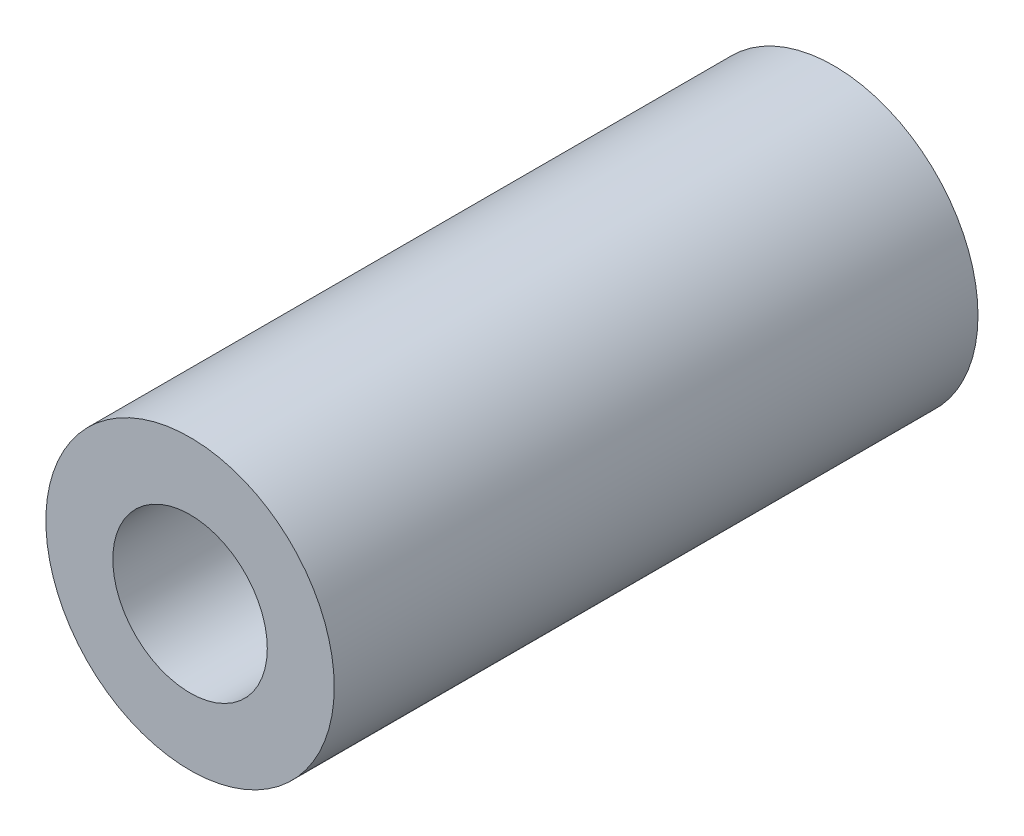
ISO-10303-21;
HEADER;
FILE_DESCRIPTION(('STEP AP214'),'2;1');
FILE_NAME('part.step','',(''),(''),'','','');
FILE_SCHEMA(('AUTOMOTIVE_DESIGN { 1 0 10303 214 1 1 1 1 }'));
ENDSEC;
DATA;
#1=APPLICATION_CONTEXT('core data for automotive mechanical design processes');
#2=APPLICATION_PROTOCOL_DEFINITION('international standard','automotive_design',2000,#1);
#3=PRODUCT_CONTEXT('',#1,'mechanical');
#4=PRODUCT('Part','Part','',(#3));
#5=PRODUCT_RELATED_PRODUCT_CATEGORY('part','',(#4));
#6=PRODUCT_DEFINITION_FORMATION('','',#4);
#7=PRODUCT_DEFINITION_CONTEXT('part definition',#1,'design');
#8=PRODUCT_DEFINITION('design','',#6,#7);
#9=PRODUCT_DEFINITION_SHAPE('','',#8);
#10=(LENGTH_UNIT() NAMED_UNIT(*) SI_UNIT(.MILLI.,.METRE.));
#11=(NAMED_UNIT(*) PLANE_ANGLE_UNIT() SI_UNIT($,.RADIAN.));
#12=(NAMED_UNIT(*) SI_UNIT($,.STERADIAN.) SOLID_ANGLE_UNIT());
#13=UNCERTAINTY_MEASURE_WITH_UNIT(LENGTH_MEASURE(1.E-05),#10,'distance_accuracy_value','');
#14=(GEOMETRIC_REPRESENTATION_CONTEXT(3) GLOBAL_UNCERTAINTY_ASSIGNED_CONTEXT((#13)) GLOBAL_UNIT_ASSIGNED_CONTEXT((#10,
#11,#12)) REPRESENTATION_CONTEXT('',''));
#15=CARTESIAN_POINT('',(0.,0.,0.));
#16=DIRECTION('',(0.,0.,1.));
#17=DIRECTION('',(1.,0.,0.));
#18=AXIS2_PLACEMENT_3D('',#15,#16,#17);
#19=CARTESIAN_POINT('',(0.,0.,12.5));
#20=DIRECTION('',(0.,0.,1.));
#21=DIRECTION('',(1.,0.,0.));
#22=AXIS2_PLACEMENT_3D('',#19,#20,#21);
#23=PLANE('',#22);
#24=CARTESIAN_POINT('',(0.,0.,12.5));
#25=DIRECTION('',(0.,0.,1.));
#26=DIRECTION('',(1.,0.,0.));
#27=AXIS2_PLACEMENT_3D('',#24,#25,#26);
#28=CIRCLE('',#27,2.8);
#29=CARTESIAN_POINT('',(2.8,0.,12.5));
#30=VERTEX_POINT('',#29);
#31=EDGE_CURVE('E10',#30,#30,#28,.T.);
#32=ORIENTED_EDGE('',*,*,#31,.T.);
#33=EDGE_LOOP('',(#32));
#34=FACE_BOUND('',#33,.T.);
#35=CARTESIAN_POINT('',(0.,0.,12.5));
#36=DIRECTION('',(0.,0.,1.));
#37=DIRECTION('',(1.,0.,0.));
#38=AXIS2_PLACEMENT_3D('',#35,#36,#37);
#39=CIRCLE('',#38,1.5);
#40=CARTESIAN_POINT('',(1.5,0.,12.5));
#41=VERTEX_POINT('',#40);
#42=EDGE_CURVE('E46',#41,#41,#39,.T.);
#43=ORIENTED_EDGE('',*,*,#42,.F.);
#44=EDGE_LOOP('',(#43));
#45=FACE_BOUND('',#44,.T.);
#46=ADVANCED_FACE('F35',(#34,#45),#23,.T.);
#47=CARTESIAN_POINT('',(0.,0.,0.));
#48=DIRECTION('',(0.,0.,1.));
#49=DIRECTION('',(1.,0.,0.));
#50=AXIS2_PLACEMENT_3D('',#47,#48,#49);
#51=PLANE('',#50);
#52=CARTESIAN_POINT('',(0.,0.,0.));
#53=DIRECTION('',(0.,0.,1.));
#54=DIRECTION('',(1.,0.,0.));
#55=AXIS2_PLACEMENT_3D('',#52,#53,#54);
#56=CIRCLE('',#55,2.8);
#57=CARTESIAN_POINT('',(2.8,0.,0.));
#58=VERTEX_POINT('',#57);
#59=EDGE_CURVE('E39',#58,#58,#56,.T.);
#60=ORIENTED_EDGE('',*,*,#59,.F.);
#61=EDGE_LOOP('',(#60));
#62=FACE_BOUND('',#61,.T.);
#63=CARTESIAN_POINT('',(0.,0.,0.));
#64=DIRECTION('',(0.,0.,1.));
#65=DIRECTION('',(1.,0.,0.));
#66=AXIS2_PLACEMENT_3D('',#63,#64,#65);
#67=CIRCLE('',#66,1.5);
#68=CARTESIAN_POINT('',(1.5,0.,0.));
#69=VERTEX_POINT('',#68);
#70=EDGE_CURVE('E48',#69,#69,#67,.T.);
#71=ORIENTED_EDGE('',*,*,#70,.T.);
#72=EDGE_LOOP('',(#71));
#73=FACE_BOUND('',#72,.T.);
#74=ADVANCED_FACE('F58',(#62,#73),#51,.F.);
#75=CARTESIAN_POINT('',(0.,0.,12.5));
#76=DIRECTION('',(0.,0.,-1.));
#77=DIRECTION('',(-1.,0.,0.));
#78=AXIS2_PLACEMENT_3D('',#75,#76,#77);
#79=CYLINDRICAL_SURFACE('',#78,2.8);
#80=ORIENTED_EDGE('',*,*,#31,.F.);
#81=EDGE_LOOP('',(#80));
#82=FACE_BOUND('',#81,.T.);
#83=ORIENTED_EDGE('',*,*,#59,.T.);
#84=EDGE_LOOP('',(#83));
#85=FACE_BOUND('',#84,.T.);
#86=ADVANCED_FACE('F37',(#82,#85),#79,.T.);
#87=CARTESIAN_POINT('',(0.,0.,12.5));
#88=DIRECTION('',(0.,0.,-1.));
#89=DIRECTION('',(-1.,0.,0.));
#90=AXIS2_PLACEMENT_3D('',#87,#88,#89);
#91=CYLINDRICAL_SURFACE('',#90,1.5);
#92=ORIENTED_EDGE('',*,*,#42,.T.);
#93=EDGE_LOOP('',(#92));
#94=FACE_BOUND('',#93,.T.);
#95=ORIENTED_EDGE('',*,*,#70,.F.);
#96=EDGE_LOOP('',(#95));
#97=FACE_BOUND('',#96,.T.);
#98=ADVANCED_FACE('F54',(#94,#97),#91,.F.);
#99=CLOSED_SHELL('',(#46,#74,#86,#98));
#100=MANIFOLD_SOLID_BREP('B2',#99);
#101=ADVANCED_BREP_SHAPE_REPRESENTATION('',(#18,#100),#14);
#102=SHAPE_DEFINITION_REPRESENTATION(#9,#101);
ENDSEC;
END-ISO-10303-21;
